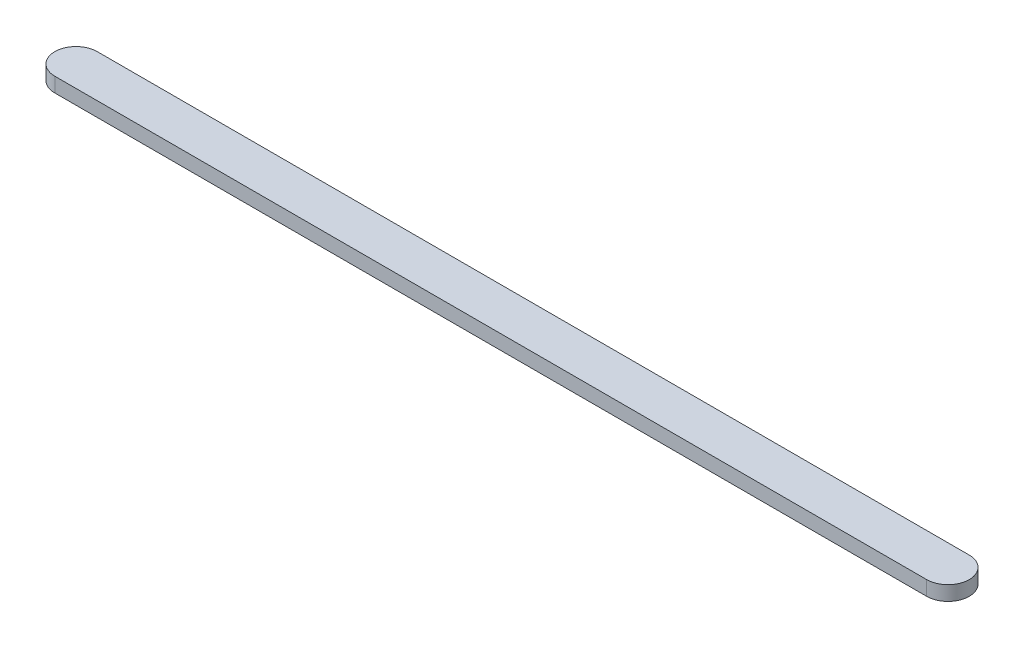
ISO-10303-21;
HEADER;
FILE_DESCRIPTION(('STEP AP214'),'2;1');
FILE_NAME('part.step','',(''),(''),'','','');
FILE_SCHEMA(('AUTOMOTIVE_DESIGN { 1 0 10303 214 1 1 1 1 }'));
ENDSEC;
DATA;
#1=APPLICATION_CONTEXT('core data for automotive mechanical design processes');
#2=APPLICATION_PROTOCOL_DEFINITION('international standard','automotive_design',2000,#1);
#3=PRODUCT_CONTEXT('',#1,'mechanical');
#4=PRODUCT('Part','Part','',(#3));
#5=PRODUCT_RELATED_PRODUCT_CATEGORY('part','',(#4));
#6=PRODUCT_DEFINITION_FORMATION('','',#4);
#7=PRODUCT_DEFINITION_CONTEXT('part definition',#1,'design');
#8=PRODUCT_DEFINITION('design','',#6,#7);
#9=PRODUCT_DEFINITION_SHAPE('','',#8);
#10=(LENGTH_UNIT() NAMED_UNIT(*) SI_UNIT(.MILLI.,.METRE.));
#11=(NAMED_UNIT(*) PLANE_ANGLE_UNIT() SI_UNIT($,.RADIAN.));
#12=(NAMED_UNIT(*) SI_UNIT($,.STERADIAN.) SOLID_ANGLE_UNIT());
#13=UNCERTAINTY_MEASURE_WITH_UNIT(LENGTH_MEASURE(1.E-05),#10,'distance_accuracy_value','');
#14=(GEOMETRIC_REPRESENTATION_CONTEXT(3) GLOBAL_UNCERTAINTY_ASSIGNED_CONTEXT((#13)) GLOBAL_UNIT_ASSIGNED_CONTEXT((#10,
#11,#12)) REPRESENTATION_CONTEXT('',''));
#15=CARTESIAN_POINT('',(0.,0.,0.));
#16=DIRECTION('',(0.,0.,1.));
#17=DIRECTION('',(1.,0.,0.));
#18=AXIS2_PLACEMENT_3D('',#15,#16,#17);
#19=CARTESIAN_POINT('',(0.,2.54,0.));
#20=DIRECTION('',(0.,-1.,0.));
#21=DIRECTION('',(0.,0.,-1.));
#22=AXIS2_PLACEMENT_3D('',#19,#20,#21);
#23=CYLINDRICAL_SURFACE('',#22,3.71655518394648);
#24=CARTESIAN_POINT('',(0.,0.,0.));
#25=DIRECTION('',(0.,1.,0.));
#26=DIRECTION('',(0.,0.,1.));
#27=AXIS2_PLACEMENT_3D('',#24,#25,#26);
#28=CIRCLE('',#27,3.71655518394648);
#29=CARTESIAN_POINT('',(0.,0.,-3.71655518394648));
#30=VERTEX_POINT('',#29);
#31=CARTESIAN_POINT('',(0.,0.,3.71655518394648));
#32=VERTEX_POINT('',#31);
#33=EDGE_CURVE('E98',#30,#32,#28,.T.);
#34=ORIENTED_EDGE('',*,*,#33,.T.);
#35=DIRECTION('',(0.,-1.,0.));
#36=VECTOR('',#35,1.);
#37=CARTESIAN_POINT('',(0.,2.54,3.71655518394648));
#38=LINE('',#37,#36);
#39=CARTESIAN_POINT('',(0.,2.54,3.71655518394648));
#40=VERTEX_POINT('',#39);
#41=EDGE_CURVE('E11',#40,#32,#38,.T.);
#42=ORIENTED_EDGE('',*,*,#41,.F.);
#43=CARTESIAN_POINT('',(0.,2.54,0.));
#44=DIRECTION('',(0.,1.,0.));
#45=DIRECTION('',(0.,0.,1.));
#46=AXIS2_PLACEMENT_3D('',#43,#44,#45);
#47=CIRCLE('',#46,3.71655518394648);
#48=CARTESIAN_POINT('',(0.,2.54,-3.71655518394648));
#49=VERTEX_POINT('',#48);
#50=EDGE_CURVE('E86',#49,#40,#47,.T.);
#51=ORIENTED_EDGE('',*,*,#50,.F.);
#52=DIRECTION('',(0.,-1.,0.));
#53=VECTOR('',#52,1.);
#54=CARTESIAN_POINT('',(0.,2.54,-3.71655518394648));
#55=LINE('',#54,#53);
#56=EDGE_CURVE('E94',#49,#30,#55,.T.);
#57=ORIENTED_EDGE('',*,*,#56,.T.);
#58=EDGE_LOOP('',(#34,#42,#51,#57));
#59=FACE_BOUND('',#58,.T.);
#60=ADVANCED_FACE('F35',(#59),#23,.T.);
#61=CARTESIAN_POINT('',(0.,2.54,3.71655518394648));
#62=DIRECTION('',(0.,0.,-1.));
#63=DIRECTION('',(-1.,0.,0.));
#64=AXIS2_PLACEMENT_3D('',#61,#62,#63);
#65=PLANE('',#64);
#66=DIRECTION('',(1.,0.,0.));
#67=VECTOR('',#66,1.);
#68=CARTESIAN_POINT('',(0.,0.,3.71655518394648));
#69=LINE('',#68,#67);
#70=CARTESIAN_POINT('',(152.4,0.,3.71655518394648));
#71=VERTEX_POINT('',#70);
#72=EDGE_CURVE('E90',#32,#71,#69,.T.);
#73=ORIENTED_EDGE('',*,*,#72,.T.);
#74=DIRECTION('',(0.,-1.,0.));
#75=VECTOR('',#74,1.);
#76=CARTESIAN_POINT('',(152.4,2.54,3.71655518394648));
#77=LINE('',#76,#75);
#78=CARTESIAN_POINT('',(152.4,2.54,3.71655518394648));
#79=VERTEX_POINT('',#78);
#80=EDGE_CURVE('E43',#79,#71,#77,.T.);
#81=ORIENTED_EDGE('',*,*,#80,.F.);
#82=DIRECTION('',(1.,0.,0.));
#83=VECTOR('',#82,1.);
#84=CARTESIAN_POINT('',(0.,2.54,3.71655518394648));
#85=LINE('',#84,#83);
#86=EDGE_CURVE('E81',#40,#79,#85,.T.);
#87=ORIENTED_EDGE('',*,*,#86,.F.);
#88=ORIENTED_EDGE('',*,*,#41,.T.);
#89=EDGE_LOOP('',(#73,#81,#87,#88));
#90=FACE_BOUND('',#89,.T.);
#91=ADVANCED_FACE('F89',(#90),#65,.F.);
#92=CARTESIAN_POINT('',(152.4,2.54,0.));
#93=DIRECTION('',(0.,-1.,0.));
#94=DIRECTION('',(0.,0.,-1.));
#95=AXIS2_PLACEMENT_3D('',#92,#93,#94);
#96=CYLINDRICAL_SURFACE('',#95,3.71655518394648);
#97=CARTESIAN_POINT('',(152.4,0.,0.));
#98=DIRECTION('',(0.,1.,0.));
#99=DIRECTION('',(0.,0.,1.));
#100=AXIS2_PLACEMENT_3D('',#97,#98,#99);
#101=CIRCLE('',#100,3.71655518394648);
#102=CARTESIAN_POINT('',(152.4,0.,-3.71655518394648));
#103=VERTEX_POINT('',#102);
#104=EDGE_CURVE('E68',#71,#103,#101,.T.);
#105=ORIENTED_EDGE('',*,*,#104,.T.);
#106=DIRECTION('',(0.,-1.,0.));
#107=VECTOR('',#106,1.);
#108=CARTESIAN_POINT('',(152.4,2.54,-3.71655518394648));
#109=LINE('',#108,#107);
#110=CARTESIAN_POINT('',(152.4,2.54,-3.71655518394648));
#111=VERTEX_POINT('',#110);
#112=EDGE_CURVE('E91',#111,#103,#109,.T.);
#113=ORIENTED_EDGE('',*,*,#112,.F.);
#114=CARTESIAN_POINT('',(152.4,2.54,0.));
#115=DIRECTION('',(0.,1.,0.));
#116=DIRECTION('',(0.,0.,1.));
#117=AXIS2_PLACEMENT_3D('',#114,#115,#116);
#118=CIRCLE('',#117,3.71655518394648);
#119=EDGE_CURVE('E84',#79,#111,#118,.T.);
#120=ORIENTED_EDGE('',*,*,#119,.F.);
#121=ORIENTED_EDGE('',*,*,#80,.T.);
#122=EDGE_LOOP('',(#105,#113,#120,#121));
#123=FACE_BOUND('',#122,.T.);
#124=ADVANCED_FACE('F92',(#123),#96,.T.);
#125=CARTESIAN_POINT('',(0.,2.54,-3.71655518394648));
#126=DIRECTION('',(0.,0.,1.));
#127=DIRECTION('',(1.,0.,0.));
#128=AXIS2_PLACEMENT_3D('',#125,#126,#127);
#129=PLANE('',#128);
#130=DIRECTION('',(-1.,0.,0.));
#131=VECTOR('',#130,1.);
#132=CARTESIAN_POINT('',(0.,0.,-3.71655518394648));
#133=LINE('',#132,#131);
#134=EDGE_CURVE('E74',#103,#30,#133,.T.);
#135=ORIENTED_EDGE('',*,*,#134,.T.);
#136=ORIENTED_EDGE('',*,*,#56,.F.);
#137=DIRECTION('',(-1.,0.,0.));
#138=VECTOR('',#137,1.);
#139=CARTESIAN_POINT('',(0.,2.54,-3.71655518394648));
#140=LINE('',#139,#138);
#141=EDGE_CURVE('E51',#111,#49,#140,.T.);
#142=ORIENTED_EDGE('',*,*,#141,.F.);
#143=ORIENTED_EDGE('',*,*,#112,.T.);
#144=EDGE_LOOP('',(#135,#136,#142,#143));
#145=FACE_BOUND('',#144,.T.);
#146=ADVANCED_FACE('F105',(#145),#129,.F.);
#147=CARTESIAN_POINT('',(0.,2.54,0.));
#148=DIRECTION('',(0.,1.,0.));
#149=DIRECTION('',(0.,0.,1.));
#150=AXIS2_PLACEMENT_3D('',#147,#148,#149);
#151=PLANE('',#150);
#152=ORIENTED_EDGE('',*,*,#50,.T.);
#153=ORIENTED_EDGE('',*,*,#86,.T.);
#154=ORIENTED_EDGE('',*,*,#119,.T.);
#155=ORIENTED_EDGE('',*,*,#141,.T.);
#156=EDGE_LOOP('',(#152,#153,#154,#155));
#157=FACE_BOUND('',#156,.T.);
#158=ADVANCED_FACE('F82',(#157),#151,.T.);
#159=CARTESIAN_POINT('',(0.,0.,0.));
#160=DIRECTION('',(0.,1.,0.));
#161=DIRECTION('',(0.,0.,1.));
#162=AXIS2_PLACEMENT_3D('',#159,#160,#161);
#163=PLANE('',#162);
#164=ORIENTED_EDGE('',*,*,#33,.F.);
#165=ORIENTED_EDGE('',*,*,#134,.F.);
#166=ORIENTED_EDGE('',*,*,#104,.F.);
#167=ORIENTED_EDGE('',*,*,#72,.F.);
#168=EDGE_LOOP('',(#164,#165,#166,#167));
#169=FACE_BOUND('',#168,.T.);
#170=ADVANCED_FACE('F108',(#169),#163,.F.);
#171=CLOSED_SHELL('',(#60,#91,#124,#146,#158,#170));
#172=MANIFOLD_SOLID_BREP('B2',#171);
#173=ADVANCED_BREP_SHAPE_REPRESENTATION('',(#18,#172),#14);
#174=SHAPE_DEFINITION_REPRESENTATION(#9,#173);
ENDSEC;
END-ISO-10303-21;
